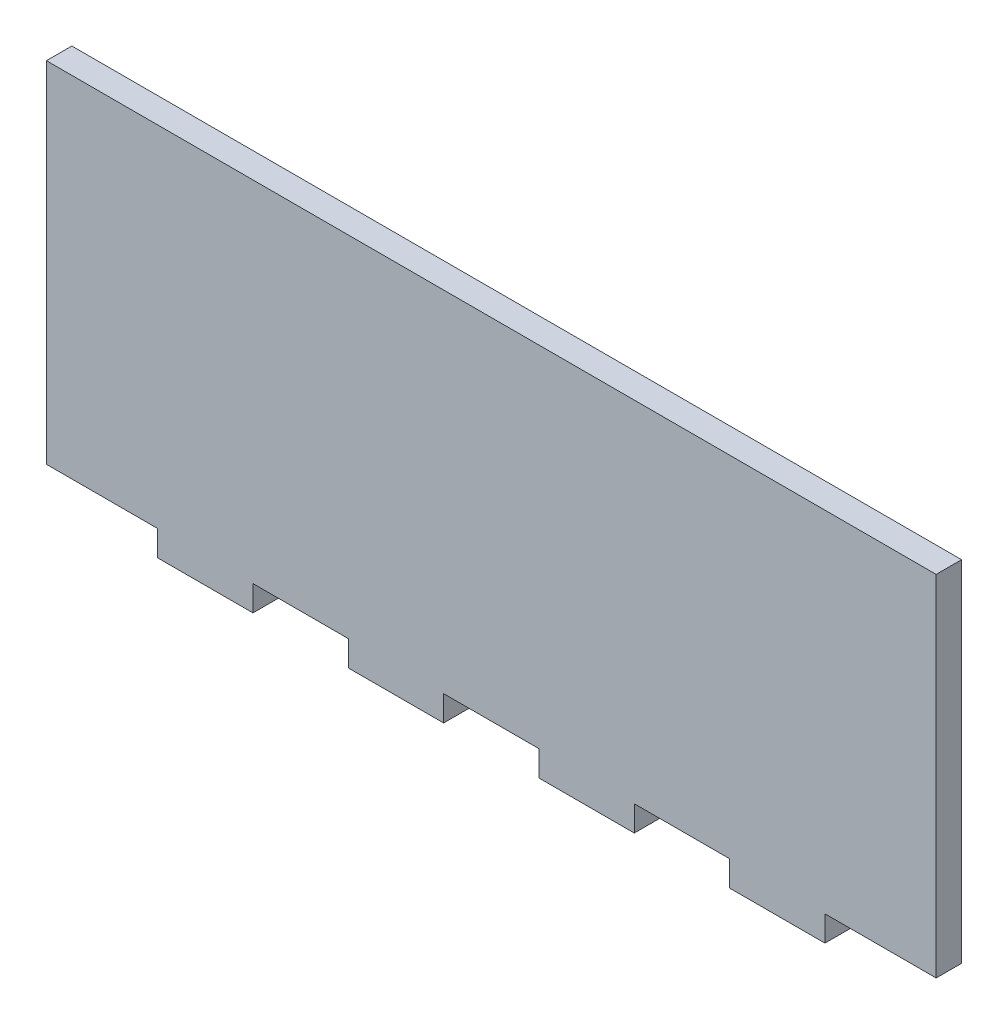
ISO-10303-21;
HEADER;
FILE_DESCRIPTION(('STEP AP214'),'2;1');
FILE_NAME('part.step','',(''),(''),'','','');
FILE_SCHEMA(('AUTOMOTIVE_DESIGN { 1 0 10303 214 1 1 1 1 }'));
ENDSEC;
DATA;
#1=APPLICATION_CONTEXT('core data for automotive mechanical design processes');
#2=APPLICATION_PROTOCOL_DEFINITION('international standard','automotive_design',2000,#1);
#3=PRODUCT_CONTEXT('',#1,'mechanical');
#4=PRODUCT('Part','Part','',(#3));
#5=PRODUCT_RELATED_PRODUCT_CATEGORY('part','',(#4));
#6=PRODUCT_DEFINITION_FORMATION('','',#4);
#7=PRODUCT_DEFINITION_CONTEXT('part definition',#1,'design');
#8=PRODUCT_DEFINITION('design','',#6,#7);
#9=PRODUCT_DEFINITION_SHAPE('','',#8);
#10=(LENGTH_UNIT() NAMED_UNIT(*) SI_UNIT(.MILLI.,.METRE.));
#11=(NAMED_UNIT(*) PLANE_ANGLE_UNIT() SI_UNIT($,.RADIAN.));
#12=(NAMED_UNIT(*) SI_UNIT($,.STERADIAN.) SOLID_ANGLE_UNIT());
#13=UNCERTAINTY_MEASURE_WITH_UNIT(LENGTH_MEASURE(1.E-05),#10,'distance_accuracy_value','');
#14=(GEOMETRIC_REPRESENTATION_CONTEXT(3) GLOBAL_UNCERTAINTY_ASSIGNED_CONTEXT((#13)) GLOBAL_UNIT_ASSIGNED_CONTEXT((#10,
#11,#12)) REPRESENTATION_CONTEXT('',''));
#15=CARTESIAN_POINT('',(0.,0.,0.));
#16=DIRECTION('',(0.,0.,1.));
#17=DIRECTION('',(1.,0.,0.));
#18=AXIS2_PLACEMENT_3D('',#15,#16,#17);
#19=CARTESIAN_POINT('',(0.,0.,0.));
#20=DIRECTION('',(0.,-1.,0.));
#21=DIRECTION('',(0.,0.,-1.));
#22=AXIS2_PLACEMENT_3D('',#19,#20,#21);
#23=PLANE('',#22);
#24=DIRECTION('',(-1.,0.,0.));
#25=VECTOR('',#24,1.);
#26=CARTESIAN_POINT('',(-70.,0.,-2.));
#27=LINE('',#26,#25);
#28=CARTESIAN_POINT('',(37.5,0.,-2.));
#29=VERTEX_POINT('',#28);
#30=CARTESIAN_POINT('',(22.5,0.,-2.));
#31=VERTEX_POINT('',#30);
#32=EDGE_CURVE('E201',#29,#31,#27,.T.);
#33=ORIENTED_EDGE('',*,*,#32,.F.);
#34=DIRECTION('',(0.,0.,-1.));
#35=VECTOR('',#34,1.);
#36=CARTESIAN_POINT('',(37.5,0.,-2.));
#37=LINE('',#36,#35);
#38=CARTESIAN_POINT('',(37.5,0.,2.));
#39=VERTEX_POINT('',#38);
#40=EDGE_CURVE('E190',#39,#29,#37,.T.);
#41=ORIENTED_EDGE('',*,*,#40,.F.);
#42=DIRECTION('',(1.,0.,0.));
#43=VECTOR('',#42,1.);
#44=CARTESIAN_POINT('',(-70.,0.,2.));
#45=LINE('',#44,#43);
#46=CARTESIAN_POINT('',(22.5,0.,2.));
#47=VERTEX_POINT('',#46);
#48=EDGE_CURVE('E200',#47,#39,#45,.T.);
#49=ORIENTED_EDGE('',*,*,#48,.F.);
#50=DIRECTION('',(0.,0.,1.));
#51=VECTOR('',#50,1.);
#52=CARTESIAN_POINT('',(22.5,0.,-2.));
#53=LINE('',#52,#51);
#54=EDGE_CURVE('E349',#31,#47,#53,.T.);
#55=ORIENTED_EDGE('',*,*,#54,.F.);
#56=EDGE_LOOP('',(#33,#41,#49,#55));
#57=FACE_BOUND('',#56,.T.);
#58=ADVANCED_FACE('F45',(#57),#23,.T.);
#59=CARTESIAN_POINT('',(52.5,0.,2.));
#60=VERTEX_POINT('',#59);
#61=CARTESIAN_POINT('',(70.,0.,2.));
#62=VERTEX_POINT('',#61);
#63=EDGE_CURVE('E210',#60,#62,#45,.T.);
#64=ORIENTED_EDGE('',*,*,#63,.F.);
#65=DIRECTION('',(0.,0.,1.));
#66=VECTOR('',#65,1.);
#67=CARTESIAN_POINT('',(52.5,0.,-2.));
#68=LINE('',#67,#66);
#69=CARTESIAN_POINT('',(52.5,0.,-2.));
#70=VERTEX_POINT('',#69);
#71=EDGE_CURVE('E204',#70,#60,#68,.T.);
#72=ORIENTED_EDGE('',*,*,#71,.F.);
#73=CARTESIAN_POINT('',(70.,0.,-2.));
#74=VERTEX_POINT('',#73);
#75=EDGE_CURVE('E247',#74,#70,#27,.T.);
#76=ORIENTED_EDGE('',*,*,#75,.F.);
#77=DIRECTION('',(0.,0.,-1.));
#78=VECTOR('',#77,1.);
#79=CARTESIAN_POINT('',(70.,0.,2.));
#80=LINE('',#79,#78);
#81=EDGE_CURVE('E256',#62,#74,#80,.T.);
#82=ORIENTED_EDGE('',*,*,#81,.F.);
#83=EDGE_LOOP('',(#64,#72,#76,#82));
#84=FACE_BOUND('',#83,.T.);
#85=ADVANCED_FACE('F404',(#84),#23,.T.);
#86=CARTESIAN_POINT('',(7.49999999999999,0.,-2.));
#87=VERTEX_POINT('',#86);
#88=CARTESIAN_POINT('',(-7.5,0.,-2.));
#89=VERTEX_POINT('',#88);
#90=EDGE_CURVE('E252',#87,#89,#27,.T.);
#91=ORIENTED_EDGE('',*,*,#90,.F.);
#92=DIRECTION('',(0.,0.,-1.));
#93=VECTOR('',#92,1.);
#94=CARTESIAN_POINT('',(7.49999999999999,0.,-2.));
#95=LINE('',#94,#93);
#96=CARTESIAN_POINT('',(7.5,0.,2.));
#97=VERTEX_POINT('',#96);
#98=EDGE_CURVE('E344',#97,#87,#95,.T.);
#99=ORIENTED_EDGE('',*,*,#98,.F.);
#100=CARTESIAN_POINT('',(-7.5,0.,2.));
#101=VERTEX_POINT('',#100);
#102=EDGE_CURVE('E209',#101,#97,#45,.T.);
#103=ORIENTED_EDGE('',*,*,#102,.F.);
#104=DIRECTION('',(0.,0.,1.));
#105=VECTOR('',#104,1.);
#106=CARTESIAN_POINT('',(-7.5,0.,-2.));
#107=LINE('',#106,#105);
#108=EDGE_CURVE('E315',#89,#101,#107,.T.);
#109=ORIENTED_EDGE('',*,*,#108,.F.);
#110=EDGE_LOOP('',(#91,#99,#103,#109));
#111=FACE_BOUND('',#110,.T.);
#112=ADVANCED_FACE('F448',(#111),#23,.T.);
#113=CARTESIAN_POINT('',(-22.5,0.,-2.));
#114=VERTEX_POINT('',#113);
#115=CARTESIAN_POINT('',(-37.5,0.,-2.));
#116=VERTEX_POINT('',#115);
#117=EDGE_CURVE('E255',#114,#116,#27,.T.);
#118=ORIENTED_EDGE('',*,*,#117,.F.);
#119=DIRECTION('',(0.,0.,-1.));
#120=VECTOR('',#119,1.);
#121=CARTESIAN_POINT('',(-22.5,0.,-2.));
#122=LINE('',#121,#120);
#123=CARTESIAN_POINT('',(-22.5,0.,2.));
#124=VERTEX_POINT('',#123);
#125=EDGE_CURVE('E299',#124,#114,#122,.T.);
#126=ORIENTED_EDGE('',*,*,#125,.F.);
#127=CARTESIAN_POINT('',(-37.5,0.,2.));
#128=VERTEX_POINT('',#127);
#129=EDGE_CURVE('E215',#128,#124,#45,.T.);
#130=ORIENTED_EDGE('',*,*,#129,.F.);
#131=DIRECTION('',(0.,0.,1.));
#132=VECTOR('',#131,1.);
#133=CARTESIAN_POINT('',(-37.5,0.,-2.));
#134=LINE('',#133,#132);
#135=EDGE_CURVE('E290',#116,#128,#134,.T.);
#136=ORIENTED_EDGE('',*,*,#135,.F.);
#137=EDGE_LOOP('',(#118,#126,#130,#136));
#138=FACE_BOUND('',#137,.T.);
#139=ADVANCED_FACE('F428',(#138),#23,.T.);
#140=DIRECTION('',(0.,0.,-1.));
#141=VECTOR('',#140,1.);
#142=CARTESIAN_POINT('',(-52.5,0.,-2.));
#143=LINE('',#142,#141);
#144=CARTESIAN_POINT('',(-52.5,0.,2.));
#145=VERTEX_POINT('',#144);
#146=CARTESIAN_POINT('',(-52.5,0.,-2.));
#147=VERTEX_POINT('',#146);
#148=EDGE_CURVE('E295',#145,#147,#143,.T.);
#149=ORIENTED_EDGE('',*,*,#148,.F.);
#150=CARTESIAN_POINT('',(-70.,0.,2.));
#151=VERTEX_POINT('',#150);
#152=EDGE_CURVE('E217',#151,#145,#45,.T.);
#153=ORIENTED_EDGE('',*,*,#152,.F.);
#154=DIRECTION('',(0.,0.,1.));
#155=VECTOR('',#154,1.);
#156=CARTESIAN_POINT('',(-70.,0.,2.));
#157=LINE('',#156,#155);
#158=CARTESIAN_POINT('',(-70.,0.,-2.));
#159=VERTEX_POINT('',#158);
#160=EDGE_CURVE('E216',#159,#151,#157,.T.);
#161=ORIENTED_EDGE('',*,*,#160,.F.);
#162=EDGE_CURVE('E244',#147,#159,#27,.T.);
#163=ORIENTED_EDGE('',*,*,#162,.F.);
#164=EDGE_LOOP('',(#149,#153,#161,#163));
#165=FACE_BOUND('',#164,.T.);
#166=ADVANCED_FACE('F243',(#165),#23,.T.);
#167=CARTESIAN_POINT('',(70.,55.,2.));
#168=DIRECTION('',(-1.,0.,0.));
#169=DIRECTION('',(0.,0.,1.));
#170=AXIS2_PLACEMENT_3D('',#167,#168,#169);
#171=PLANE('',#170);
#172=ORIENTED_EDGE('',*,*,#81,.T.);
#173=DIRECTION('',(0.,-1.,0.));
#174=VECTOR('',#173,1.);
#175=CARTESIAN_POINT('',(70.,55.,-2.));
#176=LINE('',#175,#174);
#177=CARTESIAN_POINT('',(70.,55.,-2.));
#178=VERTEX_POINT('',#177);
#179=EDGE_CURVE('E11',#178,#74,#176,.T.);
#180=ORIENTED_EDGE('',*,*,#179,.F.);
#181=DIRECTION('',(0.,0.,-1.));
#182=VECTOR('',#181,1.);
#183=CARTESIAN_POINT('',(70.,55.,2.));
#184=LINE('',#183,#182);
#185=CARTESIAN_POINT('',(70.,55.,2.));
#186=VERTEX_POINT('',#185);
#187=EDGE_CURVE('E221',#186,#178,#184,.T.);
#188=ORIENTED_EDGE('',*,*,#187,.F.);
#189=DIRECTION('',(0.,-1.,0.));
#190=VECTOR('',#189,1.);
#191=CARTESIAN_POINT('',(70.,55.,2.));
#192=LINE('',#191,#190);
#193=EDGE_CURVE('E223',#186,#62,#192,.T.);
#194=ORIENTED_EDGE('',*,*,#193,.T.);
#195=EDGE_LOOP('',(#172,#180,#188,#194));
#196=FACE_BOUND('',#195,.T.);
#197=ADVANCED_FACE('F47',(#196),#171,.F.);
#198=CARTESIAN_POINT('',(-70.,55.,-2.));
#199=DIRECTION('',(0.,0.,1.));
#200=DIRECTION('',(1.,0.,0.));
#201=AXIS2_PLACEMENT_3D('',#198,#199,#200);
#202=PLANE('',#201);
#203=ORIENTED_EDGE('',*,*,#75,.T.);
#204=DIRECTION('',(0.,1.,0.));
#205=VECTOR('',#204,1.);
#206=CARTESIAN_POINT('',(52.5,-4.,-2.));
#207=LINE('',#206,#205);
#208=CARTESIAN_POINT('',(52.5,-4.,-2.));
#209=VERTEX_POINT('',#208);
#210=EDGE_CURVE('E389',#209,#70,#207,.T.);
#211=ORIENTED_EDGE('',*,*,#210,.F.);
#212=DIRECTION('',(1.,0.,0.));
#213=VECTOR('',#212,1.);
#214=CARTESIAN_POINT('',(37.5,-4.,-2.));
#215=LINE('',#214,#213);
#216=CARTESIAN_POINT('',(37.5,-4.,-2.));
#217=VERTEX_POINT('',#216);
#218=EDGE_CURVE('E377',#217,#209,#215,.T.);
#219=ORIENTED_EDGE('',*,*,#218,.F.);
#220=DIRECTION('',(0.,1.,0.));
#221=VECTOR('',#220,1.);
#222=CARTESIAN_POINT('',(37.5,-4.,-2.));
#223=LINE('',#222,#221);
#224=EDGE_CURVE('E392',#217,#29,#223,.T.);
#225=ORIENTED_EDGE('',*,*,#224,.T.);
#226=ORIENTED_EDGE('',*,*,#32,.T.);
#227=DIRECTION('',(0.,1.,0.));
#228=VECTOR('',#227,1.);
#229=CARTESIAN_POINT('',(22.5,-4.,-2.));
#230=LINE('',#229,#228);
#231=CARTESIAN_POINT('',(22.5,-4.,-2.));
#232=VERTEX_POINT('',#231);
#233=EDGE_CURVE('E369',#232,#31,#230,.T.);
#234=ORIENTED_EDGE('',*,*,#233,.F.);
#235=DIRECTION('',(1.,0.,0.));
#236=VECTOR('',#235,1.);
#237=CARTESIAN_POINT('',(7.49999999999999,-4.,-2.));
#238=LINE('',#237,#236);
#239=CARTESIAN_POINT('',(7.49999999999999,-4.,-2.));
#240=VERTEX_POINT('',#239);
#241=EDGE_CURVE('E350',#240,#232,#238,.T.);
#242=ORIENTED_EDGE('',*,*,#241,.F.);
#243=DIRECTION('',(0.,1.,0.));
#244=VECTOR('',#243,1.);
#245=CARTESIAN_POINT('',(7.49999999999999,-4.,-2.));
#246=LINE('',#245,#244);
#247=EDGE_CURVE('E203',#240,#87,#246,.T.);
#248=ORIENTED_EDGE('',*,*,#247,.T.);
#249=ORIENTED_EDGE('',*,*,#90,.T.);
#250=DIRECTION('',(0.,1.,0.));
#251=VECTOR('',#250,1.);
#252=CARTESIAN_POINT('',(-7.5,-4.,-2.));
#253=LINE('',#252,#251);
#254=CARTESIAN_POINT('',(-7.5,-4.,-2.));
#255=VERTEX_POINT('',#254);
#256=EDGE_CURVE('E337',#255,#89,#253,.T.);
#257=ORIENTED_EDGE('',*,*,#256,.F.);
#258=DIRECTION('',(1.,0.,0.));
#259=VECTOR('',#258,1.);
#260=CARTESIAN_POINT('',(-22.5,-4.,-2.));
#261=LINE('',#260,#259);
#262=CARTESIAN_POINT('',(-22.5,-4.,-2.));
#263=VERTEX_POINT('',#262);
#264=EDGE_CURVE('E316',#263,#255,#261,.T.);
#265=ORIENTED_EDGE('',*,*,#264,.F.);
#266=DIRECTION('',(0.,1.,0.));
#267=VECTOR('',#266,1.);
#268=CARTESIAN_POINT('',(-22.5,-4.,-2.));
#269=LINE('',#268,#267);
#270=EDGE_CURVE('E341',#263,#114,#269,.T.);
#271=ORIENTED_EDGE('',*,*,#270,.T.);
#272=ORIENTED_EDGE('',*,*,#117,.T.);
#273=DIRECTION('',(0.,1.,0.));
#274=VECTOR('',#273,1.);
#275=CARTESIAN_POINT('',(-37.5,-4.,-2.));
#276=LINE('',#275,#274);
#277=CARTESIAN_POINT('',(-37.5,-4.,-2.));
#278=VERTEX_POINT('',#277);
#279=EDGE_CURVE('E265',#278,#116,#276,.T.);
#280=ORIENTED_EDGE('',*,*,#279,.F.);
#281=DIRECTION('',(1.,0.,0.));
#282=VECTOR('',#281,1.);
#283=CARTESIAN_POINT('',(-52.5,-4.,-2.));
#284=LINE('',#283,#282);
#285=CARTESIAN_POINT('',(-52.5,-4.,-2.));
#286=VERTEX_POINT('',#285);
#287=EDGE_CURVE('E305',#286,#278,#284,.T.);
#288=ORIENTED_EDGE('',*,*,#287,.F.);
#289=DIRECTION('',(0.,1.,0.));
#290=VECTOR('',#289,1.);
#291=CARTESIAN_POINT('',(-52.5,-4.,-2.));
#292=LINE('',#291,#290);
#293=EDGE_CURVE('E260',#286,#147,#292,.T.);
#294=ORIENTED_EDGE('',*,*,#293,.T.);
#295=ORIENTED_EDGE('',*,*,#162,.T.);
#296=DIRECTION('',(0.,-1.,0.));
#297=VECTOR('',#296,1.);
#298=CARTESIAN_POINT('',(-70.,55.,-2.));
#299=LINE('',#298,#297);
#300=CARTESIAN_POINT('',(-70.,55.,-2.));
#301=VERTEX_POINT('',#300);
#302=EDGE_CURVE('E54',#301,#159,#299,.T.);
#303=ORIENTED_EDGE('',*,*,#302,.F.);
#304=DIRECTION('',(-1.,0.,0.));
#305=VECTOR('',#304,1.);
#306=CARTESIAN_POINT('',(-70.,55.,-2.));
#307=LINE('',#306,#305);
#308=EDGE_CURVE('E272',#178,#301,#307,.T.);
#309=ORIENTED_EDGE('',*,*,#308,.F.);
#310=ORIENTED_EDGE('',*,*,#179,.T.);
#311=EDGE_LOOP('',(#203,#211,#219,#225,#226,#234,#242,#248,#249,#257,#265,#271,#272,#280,#288,
#294,#295,#303,#309,#310));
#312=FACE_BOUND('',#311,.T.);
#313=ADVANCED_FACE('F394',(#312),#202,.F.);
#314=CARTESIAN_POINT('',(-70.,55.,2.));
#315=DIRECTION('',(1.,0.,0.));
#316=DIRECTION('',(0.,0.,-1.));
#317=AXIS2_PLACEMENT_3D('',#314,#315,#316);
#318=PLANE('',#317);
#319=ORIENTED_EDGE('',*,*,#160,.T.);
#320=DIRECTION('',(0.,-1.,0.));
#321=VECTOR('',#320,1.);
#322=CARTESIAN_POINT('',(-70.,55.,2.));
#323=LINE('',#322,#321);
#324=CARTESIAN_POINT('',(-70.,55.,2.));
#325=VERTEX_POINT('',#324);
#326=EDGE_CURVE('E227',#325,#151,#323,.T.);
#327=ORIENTED_EDGE('',*,*,#326,.F.);
#328=DIRECTION('',(0.,0.,1.));
#329=VECTOR('',#328,1.);
#330=CARTESIAN_POINT('',(-70.,55.,2.));
#331=LINE('',#330,#329);
#332=EDGE_CURVE('E239',#301,#325,#331,.T.);
#333=ORIENTED_EDGE('',*,*,#332,.F.);
#334=ORIENTED_EDGE('',*,*,#302,.T.);
#335=EDGE_LOOP('',(#319,#327,#333,#334));
#336=FACE_BOUND('',#335,.T.);
#337=ADVANCED_FACE('F237',(#336),#318,.F.);
#338=CARTESIAN_POINT('',(-70.,55.,2.));
#339=DIRECTION('',(0.,0.,-1.));
#340=DIRECTION('',(-1.,0.,0.));
#341=AXIS2_PLACEMENT_3D('',#338,#339,#340);
#342=PLANE('',#341);
#343=ORIENTED_EDGE('',*,*,#152,.T.);
#344=DIRECTION('',(0.,1.,0.));
#345=VECTOR('',#344,1.);
#346=CARTESIAN_POINT('',(-52.5,-4.,2.));
#347=LINE('',#346,#345);
#348=CARTESIAN_POINT('',(-52.5,-4.,2.));
#349=VERTEX_POINT('',#348);
#350=EDGE_CURVE('E285',#349,#145,#347,.T.);
#351=ORIENTED_EDGE('',*,*,#350,.F.);
#352=DIRECTION('',(-1.,0.,0.));
#353=VECTOR('',#352,1.);
#354=CARTESIAN_POINT('',(-52.5,-4.,2.));
#355=LINE('',#354,#353);
#356=CARTESIAN_POINT('',(-37.5,-4.,2.));
#357=VERTEX_POINT('',#356);
#358=EDGE_CURVE('E289',#357,#349,#355,.T.);
#359=ORIENTED_EDGE('',*,*,#358,.F.);
#360=DIRECTION('',(0.,1.,0.));
#361=VECTOR('',#360,1.);
#362=CARTESIAN_POINT('',(-37.5,-4.,2.));
#363=LINE('',#362,#361);
#364=EDGE_CURVE('E281',#357,#128,#363,.T.);
#365=ORIENTED_EDGE('',*,*,#364,.T.);
#366=ORIENTED_EDGE('',*,*,#129,.T.);
#367=DIRECTION('',(0.,1.,0.));
#368=VECTOR('',#367,1.);
#369=CARTESIAN_POINT('',(-22.5,-4.,2.));
#370=LINE('',#369,#368);
#371=CARTESIAN_POINT('',(-22.5,-4.,2.));
#372=VERTEX_POINT('',#371);
#373=EDGE_CURVE('E325',#372,#124,#370,.T.);
#374=ORIENTED_EDGE('',*,*,#373,.F.);
#375=DIRECTION('',(-1.,0.,0.));
#376=VECTOR('',#375,1.);
#377=CARTESIAN_POINT('',(-22.5,-4.,2.));
#378=LINE('',#377,#376);
#379=CARTESIAN_POINT('',(-7.5,-4.,2.));
#380=VERTEX_POINT('',#379);
#381=EDGE_CURVE('E322',#380,#372,#378,.T.);
#382=ORIENTED_EDGE('',*,*,#381,.F.);
#383=DIRECTION('',(0.,1.,0.));
#384=VECTOR('',#383,1.);
#385=CARTESIAN_POINT('',(-7.5,-4.,2.));
#386=LINE('',#385,#384);
#387=EDGE_CURVE('E334',#380,#101,#386,.T.);
#388=ORIENTED_EDGE('',*,*,#387,.T.);
#389=ORIENTED_EDGE('',*,*,#102,.T.);
#390=DIRECTION('',(0.,1.,0.));
#391=VECTOR('',#390,1.);
#392=CARTESIAN_POINT('',(7.5,-4.,2.));
#393=LINE('',#392,#391);
#394=CARTESIAN_POINT('',(7.5,-4.,2.));
#395=VERTEX_POINT('',#394);
#396=EDGE_CURVE('E359',#395,#97,#393,.T.);
#397=ORIENTED_EDGE('',*,*,#396,.F.);
#398=DIRECTION('',(-1.,0.,0.));
#399=VECTOR('',#398,1.);
#400=CARTESIAN_POINT('',(7.5,-4.,2.));
#401=LINE('',#400,#399);
#402=CARTESIAN_POINT('',(22.5,-4.,2.));
#403=VERTEX_POINT('',#402);
#404=EDGE_CURVE('E356',#403,#395,#401,.T.);
#405=ORIENTED_EDGE('',*,*,#404,.F.);
#406=DIRECTION('',(0.,1.,0.));
#407=VECTOR('',#406,1.);
#408=CARTESIAN_POINT('',(22.5,-4.,2.));
#409=LINE('',#408,#407);
#410=EDGE_CURVE('E68',#403,#47,#409,.T.);
#411=ORIENTED_EDGE('',*,*,#410,.T.);
#412=ORIENTED_EDGE('',*,*,#48,.T.);
#413=DIRECTION('',(0.,1.,0.));
#414=VECTOR('',#413,1.);
#415=CARTESIAN_POINT('',(37.5,-4.,2.));
#416=LINE('',#415,#414);
#417=CARTESIAN_POINT('',(37.5,-4.,2.));
#418=VERTEX_POINT('',#417);
#419=EDGE_CURVE('E186',#418,#39,#416,.T.);
#420=ORIENTED_EDGE('',*,*,#419,.F.);
#421=DIRECTION('',(-1.,0.,0.));
#422=VECTOR('',#421,1.);
#423=CARTESIAN_POINT('',(37.5,-4.,2.));
#424=LINE('',#423,#422);
#425=CARTESIAN_POINT('',(52.5,-4.,2.));
#426=VERTEX_POINT('',#425);
#427=EDGE_CURVE('E195',#426,#418,#424,.T.);
#428=ORIENTED_EDGE('',*,*,#427,.F.);
#429=DIRECTION('',(0.,1.,0.));
#430=VECTOR('',#429,1.);
#431=CARTESIAN_POINT('',(52.5,-4.,2.));
#432=LINE('',#431,#430);
#433=EDGE_CURVE('E61',#426,#60,#432,.T.);
#434=ORIENTED_EDGE('',*,*,#433,.T.);
#435=ORIENTED_EDGE('',*,*,#63,.T.);
#436=ORIENTED_EDGE('',*,*,#193,.F.);
#437=DIRECTION('',(1.,0.,0.));
#438=VECTOR('',#437,1.);
#439=CARTESIAN_POINT('',(-70.,55.,2.));
#440=LINE('',#439,#438);
#441=EDGE_CURVE('E228',#325,#186,#440,.T.);
#442=ORIENTED_EDGE('',*,*,#441,.F.);
#443=ORIENTED_EDGE('',*,*,#326,.T.);
#444=EDGE_LOOP('',(#343,#351,#359,#365,#366,#374,#382,#388,#389,#397,#405,#411,#412,#420,#428,
#434,#435,#436,#442,#443));
#445=FACE_BOUND('',#444,.T.);
#446=ADVANCED_FACE('F207',(#445),#342,.F.);
#447=CARTESIAN_POINT('',(0.,55.,0.));
#448=DIRECTION('',(0.,-1.,0.));
#449=DIRECTION('',(0.,0.,-1.));
#450=AXIS2_PLACEMENT_3D('',#447,#448,#449);
#451=PLANE('',#450);
#452=ORIENTED_EDGE('',*,*,#187,.T.);
#453=ORIENTED_EDGE('',*,*,#308,.T.);
#454=ORIENTED_EDGE('',*,*,#332,.T.);
#455=ORIENTED_EDGE('',*,*,#441,.T.);
#456=EDGE_LOOP('',(#452,#453,#454,#455));
#457=FACE_BOUND('',#456,.T.);
#458=ADVANCED_FACE('F409',(#457),#451,.F.);
#459=CARTESIAN_POINT('',(-52.5,-4.,-2.));
#460=DIRECTION('',(1.,0.,0.));
#461=DIRECTION('',(0.,0.,-1.));
#462=AXIS2_PLACEMENT_3D('',#459,#460,#461);
#463=PLANE('',#462);
#464=ORIENTED_EDGE('',*,*,#148,.T.);
#465=ORIENTED_EDGE('',*,*,#293,.F.);
#466=DIRECTION('',(0.,0.,-1.));
#467=VECTOR('',#466,1.);
#468=CARTESIAN_POINT('',(-52.5,-4.,-2.));
#469=LINE('',#468,#467);
#470=EDGE_CURVE('E294',#349,#286,#469,.T.);
#471=ORIENTED_EDGE('',*,*,#470,.F.);
#472=ORIENTED_EDGE('',*,*,#350,.T.);
#473=EDGE_LOOP('',(#464,#465,#471,#472));
#474=FACE_BOUND('',#473,.T.);
#475=ADVANCED_FACE('F414',(#474),#463,.F.);
#476=CARTESIAN_POINT('',(-37.5,-4.,-2.));
#477=DIRECTION('',(-1.,0.,0.));
#478=DIRECTION('',(0.,0.,1.));
#479=AXIS2_PLACEMENT_3D('',#476,#477,#478);
#480=PLANE('',#479);
#481=ORIENTED_EDGE('',*,*,#135,.T.);
#482=ORIENTED_EDGE('',*,*,#364,.F.);
#483=DIRECTION('',(0.,0.,1.));
#484=VECTOR('',#483,1.);
#485=CARTESIAN_POINT('',(-37.5,-4.,-2.));
#486=LINE('',#485,#484);
#487=EDGE_CURVE('E302',#278,#357,#486,.T.);
#488=ORIENTED_EDGE('',*,*,#487,.F.);
#489=ORIENTED_EDGE('',*,*,#279,.T.);
#490=EDGE_LOOP('',(#481,#482,#488,#489));
#491=FACE_BOUND('',#490,.T.);
#492=ADVANCED_FACE('F424',(#491),#480,.F.);
#493=CARTESIAN_POINT('',(0.,-4.,0.));
#494=DIRECTION('',(0.,1.,0.));
#495=DIRECTION('',(0.,0.,1.));
#496=AXIS2_PLACEMENT_3D('',#493,#494,#495);
#497=PLANE('',#496);
#498=ORIENTED_EDGE('',*,*,#470,.T.);
#499=ORIENTED_EDGE('',*,*,#287,.T.);
#500=ORIENTED_EDGE('',*,*,#487,.T.);
#501=ORIENTED_EDGE('',*,*,#358,.T.);
#502=EDGE_LOOP('',(#498,#499,#500,#501));
#503=FACE_BOUND('',#502,.T.);
#504=ADVANCED_FACE('F417',(#503),#497,.F.);
#505=CARTESIAN_POINT('',(-22.5,-4.,-2.));
#506=DIRECTION('',(1.,0.,0.));
#507=DIRECTION('',(0.,0.,-1.));
#508=AXIS2_PLACEMENT_3D('',#505,#506,#507);
#509=PLANE('',#508);
#510=ORIENTED_EDGE('',*,*,#125,.T.);
#511=ORIENTED_EDGE('',*,*,#270,.F.);
#512=DIRECTION('',(0.,0.,-1.));
#513=VECTOR('',#512,1.);
#514=CARTESIAN_POINT('',(-22.5,-4.,-2.));
#515=LINE('',#514,#513);
#516=EDGE_CURVE('E311',#372,#263,#515,.T.);
#517=ORIENTED_EDGE('',*,*,#516,.F.);
#518=ORIENTED_EDGE('',*,*,#373,.T.);
#519=EDGE_LOOP('',(#510,#511,#517,#518));
#520=FACE_BOUND('',#519,.T.);
#521=ADVANCED_FACE('F433',(#520),#509,.F.);
#522=CARTESIAN_POINT('',(-7.5,-4.,-2.));
#523=DIRECTION('',(-1.,0.,0.));
#524=DIRECTION('',(0.,0.,1.));
#525=AXIS2_PLACEMENT_3D('',#522,#523,#524);
#526=PLANE('',#525);
#527=ORIENTED_EDGE('',*,*,#108,.T.);
#528=ORIENTED_EDGE('',*,*,#387,.F.);
#529=DIRECTION('',(0.,0.,1.));
#530=VECTOR('',#529,1.);
#531=CARTESIAN_POINT('',(-7.5,-4.,-2.));
#532=LINE('',#531,#530);
#533=EDGE_CURVE('E319',#255,#380,#532,.T.);
#534=ORIENTED_EDGE('',*,*,#533,.F.);
#535=ORIENTED_EDGE('',*,*,#256,.T.);
#536=EDGE_LOOP('',(#527,#528,#534,#535));
#537=FACE_BOUND('',#536,.T.);
#538=ADVANCED_FACE('F442',(#537),#526,.F.);
#539=CARTESIAN_POINT('',(0.,-4.,0.));
#540=DIRECTION('',(0.,1.,0.));
#541=DIRECTION('',(0.,0.,1.));
#542=AXIS2_PLACEMENT_3D('',#539,#540,#541);
#543=PLANE('',#542);
#544=ORIENTED_EDGE('',*,*,#516,.T.);
#545=ORIENTED_EDGE('',*,*,#264,.T.);
#546=ORIENTED_EDGE('',*,*,#533,.T.);
#547=ORIENTED_EDGE('',*,*,#381,.T.);
#548=EDGE_LOOP('',(#544,#545,#546,#547));
#549=FACE_BOUND('',#548,.T.);
#550=ADVANCED_FACE('F438',(#549),#543,.F.);
#551=CARTESIAN_POINT('',(7.49999999999999,-4.,-2.));
#552=DIRECTION('',(1.,0.,0.));
#553=DIRECTION('',(0.,0.,-1.));
#554=AXIS2_PLACEMENT_3D('',#551,#552,#553);
#555=PLANE('',#554);
#556=ORIENTED_EDGE('',*,*,#98,.T.);
#557=ORIENTED_EDGE('',*,*,#247,.F.);
#558=DIRECTION('',(0.,0.,-1.));
#559=VECTOR('',#558,1.);
#560=CARTESIAN_POINT('',(7.49999999999999,-4.,-2.));
#561=LINE('',#560,#559);
#562=EDGE_CURVE('E345',#395,#240,#561,.T.);
#563=ORIENTED_EDGE('',*,*,#562,.F.);
#564=ORIENTED_EDGE('',*,*,#396,.T.);
#565=EDGE_LOOP('',(#556,#557,#563,#564));
#566=FACE_BOUND('',#565,.T.);
#567=ADVANCED_FACE('F453',(#566),#555,.F.);
#568=CARTESIAN_POINT('',(22.5,-4.,-2.));
#569=DIRECTION('',(-1.,0.,0.));
#570=DIRECTION('',(0.,0.,1.));
#571=AXIS2_PLACEMENT_3D('',#568,#569,#570);
#572=PLANE('',#571);
#573=ORIENTED_EDGE('',*,*,#54,.T.);
#574=ORIENTED_EDGE('',*,*,#410,.F.);
#575=DIRECTION('',(0.,0.,1.));
#576=VECTOR('',#575,1.);
#577=CARTESIAN_POINT('',(22.5,-4.,-2.));
#578=LINE('',#577,#576);
#579=EDGE_CURVE('E353',#232,#403,#578,.T.);
#580=ORIENTED_EDGE('',*,*,#579,.F.);
#581=ORIENTED_EDGE('',*,*,#233,.T.);
#582=EDGE_LOOP('',(#573,#574,#580,#581));
#583=FACE_BOUND('',#582,.T.);
#584=ADVANCED_FACE('F458',(#583),#572,.F.);
#585=CARTESIAN_POINT('',(0.,-4.,0.));
#586=DIRECTION('',(0.,1.,0.));
#587=DIRECTION('',(0.,0.,1.));
#588=AXIS2_PLACEMENT_3D('',#585,#586,#587);
#589=PLANE('',#588);
#590=ORIENTED_EDGE('',*,*,#562,.T.);
#591=ORIENTED_EDGE('',*,*,#241,.T.);
#592=ORIENTED_EDGE('',*,*,#579,.T.);
#593=ORIENTED_EDGE('',*,*,#404,.T.);
#594=EDGE_LOOP('',(#590,#591,#592,#593));
#595=FACE_BOUND('',#594,.T.);
#596=ADVANCED_FACE('F455',(#595),#589,.F.);
#597=CARTESIAN_POINT('',(37.5,-4.,-2.));
#598=DIRECTION('',(1.,0.,0.));
#599=DIRECTION('',(0.,0.,-1.));
#600=AXIS2_PLACEMENT_3D('',#597,#598,#599);
#601=PLANE('',#600);
#602=ORIENTED_EDGE('',*,*,#40,.T.);
#603=ORIENTED_EDGE('',*,*,#224,.F.);
#604=DIRECTION('',(0.,0.,-1.));
#605=VECTOR('',#604,1.);
#606=CARTESIAN_POINT('',(37.5,-4.,-2.));
#607=LINE('',#606,#605);
#608=EDGE_CURVE('E193',#418,#217,#607,.T.);
#609=ORIENTED_EDGE('',*,*,#608,.F.);
#610=ORIENTED_EDGE('',*,*,#419,.T.);
#611=EDGE_LOOP('',(#602,#603,#609,#610));
#612=FACE_BOUND('',#611,.T.);
#613=ADVANCED_FACE('F188',(#612),#601,.F.);
#614=CARTESIAN_POINT('',(52.5,-4.,-2.));
#615=DIRECTION('',(-1.,0.,0.));
#616=DIRECTION('',(0.,0.,1.));
#617=AXIS2_PLACEMENT_3D('',#614,#615,#616);
#618=PLANE('',#617);
#619=ORIENTED_EDGE('',*,*,#71,.T.);
#620=ORIENTED_EDGE('',*,*,#433,.F.);
#621=DIRECTION('',(0.,0.,1.));
#622=VECTOR('',#621,1.);
#623=CARTESIAN_POINT('',(52.5,-4.,-2.));
#624=LINE('',#623,#622);
#625=EDGE_CURVE('E380',#209,#426,#624,.T.);
#626=ORIENTED_EDGE('',*,*,#625,.F.);
#627=ORIENTED_EDGE('',*,*,#210,.T.);
#628=EDGE_LOOP('',(#619,#620,#626,#627));
#629=FACE_BOUND('',#628,.T.);
#630=ADVANCED_FACE('F400',(#629),#618,.F.);
#631=CARTESIAN_POINT('',(0.,-4.,0.));
#632=DIRECTION('',(0.,1.,0.));
#633=DIRECTION('',(0.,0.,1.));
#634=AXIS2_PLACEMENT_3D('',#631,#632,#633);
#635=PLANE('',#634);
#636=ORIENTED_EDGE('',*,*,#608,.T.);
#637=ORIENTED_EDGE('',*,*,#218,.T.);
#638=ORIENTED_EDGE('',*,*,#625,.T.);
#639=ORIENTED_EDGE('',*,*,#427,.T.);
#640=EDGE_LOOP('',(#636,#637,#638,#639));
#641=FACE_BOUND('',#640,.T.);
#642=ADVANCED_FACE('F398',(#641),#635,.F.);
#643=CLOSED_SHELL('',(#58,#85,#112,#139,#166,#197,#313,#337,#446,#458,#475,#492,#504,#521,#538,
#550,#567,#584,#596,#613,#630,#642));
#644=MANIFOLD_SOLID_BREP('B2',#643);
#645=ADVANCED_BREP_SHAPE_REPRESENTATION('',(#18,#644),#14);
#646=SHAPE_DEFINITION_REPRESENTATION(#9,#645);
ENDSEC;
END-ISO-10303-21;
